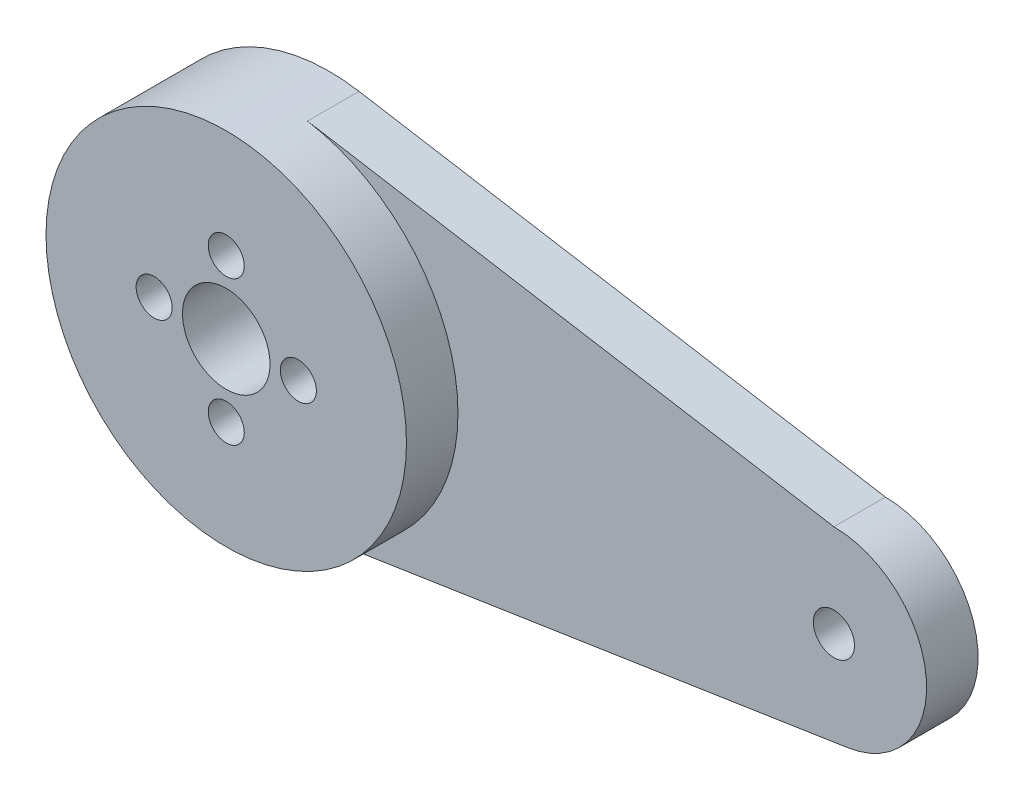
ISO-10303-21;
HEADER;
FILE_DESCRIPTION(('STEP AP214'),'2;1');
FILE_NAME('part.step','',(''),(''),'','','');
FILE_SCHEMA(('AUTOMOTIVE_DESIGN { 1 0 10303 214 1 1 1 1 }'));
ENDSEC;
DATA;
#1=APPLICATION_CONTEXT('core data for automotive mechanical design processes');
#2=APPLICATION_PROTOCOL_DEFINITION('international standard','automotive_design',2000,#1);
#3=PRODUCT_CONTEXT('',#1,'mechanical');
#4=PRODUCT('Part','Part','',(#3));
#5=PRODUCT_RELATED_PRODUCT_CATEGORY('part','',(#4));
#6=PRODUCT_DEFINITION_FORMATION('','',#4);
#7=PRODUCT_DEFINITION_CONTEXT('part definition',#1,'design');
#8=PRODUCT_DEFINITION('design','',#6,#7);
#9=PRODUCT_DEFINITION_SHAPE('','',#8);
#10=(LENGTH_UNIT() NAMED_UNIT(*) SI_UNIT(.MILLI.,.METRE.));
#11=(NAMED_UNIT(*) PLANE_ANGLE_UNIT() SI_UNIT($,.RADIAN.));
#12=(NAMED_UNIT(*) SI_UNIT($,.STERADIAN.) SOLID_ANGLE_UNIT());
#13=UNCERTAINTY_MEASURE_WITH_UNIT(LENGTH_MEASURE(1.E-05),#10,'distance_accuracy_value','');
#14=(GEOMETRIC_REPRESENTATION_CONTEXT(3) GLOBAL_UNCERTAINTY_ASSIGNED_CONTEXT((#13)) GLOBAL_UNIT_ASSIGNED_CONTEXT((#10,
#11,#12)) REPRESENTATION_CONTEXT('',''));
#15=CARTESIAN_POINT('',(0.,0.,0.));
#16=DIRECTION('',(0.,0.,1.));
#17=DIRECTION('',(1.,0.,0.));
#18=AXIS2_PLACEMENT_3D('',#15,#16,#17);
#19=CARTESIAN_POINT('',(-20.2199999704329,57.5799999999971,-5.));
#20=DIRECTION('',(0.,0.,1.));
#21=DIRECTION('',(1.,0.,0.));
#22=AXIS2_PLACEMENT_3D('',#19,#20,#21);
#23=CYLINDRICAL_SURFACE('',#22,17.500000000001);
#24=DIRECTION('',(0.,0.,1.));
#25=VECTOR('',#24,1.);
#26=CARTESIAN_POINT('',(-17.5619966812068,40.2830344130943,-5.));
#27=LINE('',#26,#25);
#28=CARTESIAN_POINT('',(-17.5619966812068,40.2830344130943,-5.));
#29=VERTEX_POINT('',#28);
#30=CARTESIAN_POINT('',(-17.5619966812068,40.2830344130943,0.));
#31=VERTEX_POINT('',#30);
#32=EDGE_CURVE('E36',#29,#31,#27,.T.);
#33=ORIENTED_EDGE('',*,*,#32,.T.);
#34=CARTESIAN_POINT('',(-20.2199999704329,57.5799999999971,0.));
#35=DIRECTION('',(0.,0.,1.));
#36=DIRECTION('',(1.,0.,0.));
#37=AXIS2_PLACEMENT_3D('',#34,#35,#36);
#38=CIRCLE('',#37,17.500000000001);
#39=CARTESIAN_POINT('',(-17.3288748871476,74.8395305774153,0.));
#40=VERTEX_POINT('',#39);
#41=EDGE_CURVE('E11',#31,#40,#38,.T.);
#42=ORIENTED_EDGE('',*,*,#41,.T.);
#43=DIRECTION('',(0.,0.,1.));
#44=VECTOR('',#43,1.);
#45=CARTESIAN_POINT('',(-17.3288748871476,74.8395305774153,-5.));
#46=LINE('',#45,#44);
#47=CARTESIAN_POINT('',(-17.3288748871476,74.8395305774153,-5.));
#48=VERTEX_POINT('',#47);
#49=EDGE_CURVE('E42',#48,#40,#46,.T.);
#50=ORIENTED_EDGE('',*,*,#49,.F.);
#51=CARTESIAN_POINT('',(-20.2199999704329,57.5799999999971,-5.));
#52=DIRECTION('',(0.,0.,1.));
#53=DIRECTION('',(1.,0.,0.));
#54=AXIS2_PLACEMENT_3D('',#51,#52,#53);
#55=CIRCLE('',#54,17.500000000001);
#56=EDGE_CURVE('E87',#48,#29,#55,.T.);
#57=ORIENTED_EDGE('',*,*,#56,.T.);
#58=EDGE_LOOP('',(#33,#42,#50,#57));
#59=FACE_BOUND('',#58,.T.);
#60=CARTESIAN_POINT('',(-20.2199999704329,57.5799999999971,5.));
#61=DIRECTION('',(0.,0.,1.));
#62=DIRECTION('',(1.,0.,0.));
#63=AXIS2_PLACEMENT_3D('',#60,#61,#62);
#64=CIRCLE('',#63,17.500000000001);
#65=CARTESIAN_POINT('',(-2.71999997043187,57.5799999999971,5.));
#66=VERTEX_POINT('',#65);
#67=EDGE_CURVE('E127',#66,#66,#64,.T.);
#68=ORIENTED_EDGE('',*,*,#67,.F.);
#69=EDGE_LOOP('',(#68));
#70=FACE_BOUND('',#69,.T.);
#71=ADVANCED_FACE('F33',(#59,#70),#23,.T.);
#72=CARTESIAN_POINT('',(-17.3288748871476,74.8395305774153,-5.));
#73=DIRECTION('',(0.165207147616288,0.986258890138127,0.));
#74=DIRECTION('',(-0.986258890138127,0.165207147616289,0.));
#75=AXIS2_PLACEMENT_3D('',#72,#73,#74);
#76=PLANE('',#75);
#77=DIRECTION('',(-0.986258890138127,0.165207147616288,0.));
#78=VECTOR('',#77,1.);
#79=CARTESIAN_POINT('',(-17.3288748871476,74.8395305774153,0.));
#80=LINE('',#79,#78);
#81=CARTESIAN_POINT('',(33.7800000295671,66.2783388585902,0.));
#82=VERTEX_POINT('',#81);
#83=EDGE_CURVE('E81',#82,#40,#80,.T.);
#84=ORIENTED_EDGE('',*,*,#83,.F.);
#85=DIRECTION('',(0.,0.,1.));
#86=VECTOR('',#85,1.);
#87=CARTESIAN_POINT('',(33.7800000295671,66.2783388585902,-5.));
#88=LINE('',#87,#86);
#89=CARTESIAN_POINT('',(33.7800000295671,66.2783388585902,-5.));
#90=VERTEX_POINT('',#89);
#91=EDGE_CURVE('E71',#90,#82,#88,.T.);
#92=ORIENTED_EDGE('',*,*,#91,.F.);
#93=DIRECTION('',(-0.986258890138127,0.165207147616288,0.));
#94=VECTOR('',#93,1.);
#95=CARTESIAN_POINT('',(-17.3288748871476,74.8395305774153,-5.));
#96=LINE('',#95,#94);
#97=EDGE_CURVE('E92',#90,#48,#96,.T.);
#98=ORIENTED_EDGE('',*,*,#97,.T.);
#99=ORIENTED_EDGE('',*,*,#49,.T.);
#100=EDGE_LOOP('',(#84,#92,#98,#99));
#101=FACE_BOUND('',#100,.T.);
#102=ADVANCED_FACE('F90',(#101),#76,.T.);
#103=CARTESIAN_POINT('',(33.7800000295671,57.2783388585902,-5.));
#104=DIRECTION('',(0.,0.,1.));
#105=DIRECTION('',(1.,0.,0.));
#106=AXIS2_PLACEMENT_3D('',#103,#104,#105);
#107=CYLINDRICAL_SURFACE('',#106,9.00000000000001);
#108=CARTESIAN_POINT('',(33.7800000295671,57.2783388585902,0.));
#109=DIRECTION('',(0.,0.,1.));
#110=DIRECTION('',(-1.,0.,0.));
#111=AXIS2_PLACEMENT_3D('',#108,#109,#110);
#112=CIRCLE('',#111,9.00000000000001);
#113=CARTESIAN_POINT('',(35.1469731497404,48.382756556755,0.));
#114=VERTEX_POINT('',#113);
#115=EDGE_CURVE('E85',#114,#82,#112,.T.);
#116=ORIENTED_EDGE('',*,*,#115,.F.);
#117=DIRECTION('',(0.,0.,1.));
#118=VECTOR('',#117,1.);
#119=CARTESIAN_POINT('',(35.1469731497404,48.382756556755,-5.));
#120=LINE('',#119,#118);
#121=CARTESIAN_POINT('',(35.1469731497404,48.382756556755,-5.));
#122=VERTEX_POINT('',#121);
#123=EDGE_CURVE('E65',#122,#114,#120,.T.);
#124=ORIENTED_EDGE('',*,*,#123,.F.);
#125=CARTESIAN_POINT('',(33.7800000295671,57.2783388585902,-5.));
#126=DIRECTION('',(0.,0.,1.));
#127=DIRECTION('',(-1.,0.,0.));
#128=AXIS2_PLACEMENT_3D('',#125,#126,#127);
#129=CIRCLE('',#128,9.00000000000001);
#130=EDGE_CURVE('E106',#122,#90,#129,.T.);
#131=ORIENTED_EDGE('',*,*,#130,.T.);
#132=ORIENTED_EDGE('',*,*,#91,.T.);
#133=EDGE_LOOP('',(#116,#124,#131,#132));
#134=FACE_BOUND('',#133,.T.);
#135=ADVANCED_FACE('F168',(#134),#107,.T.);
#136=CARTESIAN_POINT('',(35.1469731497404,48.382756556755,-5.));
#137=DIRECTION('',(0.151885902241479,-0.988398033537245,0.));
#138=DIRECTION('',(0.988398033537245,0.151885902241479,0.));
#139=AXIS2_PLACEMENT_3D('',#136,#137,#138);
#140=PLANE('',#139);
#141=DIRECTION('',(0.988398033537245,0.151885902241479,0.));
#142=VECTOR('',#141,1.);
#143=CARTESIAN_POINT('',(35.1469731497404,48.382756556755,0.));
#144=LINE('',#143,#142);
#145=EDGE_CURVE('E95',#31,#114,#144,.T.);
#146=ORIENTED_EDGE('',*,*,#145,.F.);
#147=ORIENTED_EDGE('',*,*,#32,.F.);
#148=DIRECTION('',(0.988398033537245,0.151885902241479,0.));
#149=VECTOR('',#148,1.);
#150=CARTESIAN_POINT('',(35.1469731497404,48.382756556755,-5.));
#151=LINE('',#150,#149);
#152=EDGE_CURVE('E108',#29,#122,#151,.T.);
#153=ORIENTED_EDGE('',*,*,#152,.T.);
#154=ORIENTED_EDGE('',*,*,#123,.T.);
#155=EDGE_LOOP('',(#146,#147,#153,#154));
#156=FACE_BOUND('',#155,.T.);
#157=ADVANCED_FACE('F96',(#156),#140,.T.);
#158=CARTESIAN_POINT('',(-20.2199999704329,57.5799999999971,-5.));
#159=DIRECTION('',(0.,0.,1.));
#160=DIRECTION('',(1.,0.,0.));
#161=AXIS2_PLACEMENT_3D('',#158,#159,#160);
#162=PLANE('',#161);
#163=CARTESIAN_POINT('',(-13.2199999704329,57.5799999999971,-5.));
#164=DIRECTION('',(0.,0.,1.));
#165=DIRECTION('',(1.,0.,0.));
#166=AXIS2_PLACEMENT_3D('',#163,#164,#165);
#167=CIRCLE('',#166,1.75);
#168=CARTESIAN_POINT('',(-11.4699999704329,57.5799999999971,-5.));
#169=VERTEX_POINT('',#168);
#170=EDGE_CURVE('E114',#169,#169,#167,.T.);
#171=ORIENTED_EDGE('',*,*,#170,.T.);
#172=EDGE_LOOP('',(#171));
#173=FACE_BOUND('',#172,.T.);
#174=CARTESIAN_POINT('',(-27.2199999704329,57.5799999999971,-5.));
#175=DIRECTION('',(0.,0.,1.));
#176=DIRECTION('',(1.,0.,0.));
#177=AXIS2_PLACEMENT_3D('',#174,#175,#176);
#178=CIRCLE('',#177,1.75);
#179=CARTESIAN_POINT('',(-25.4699999704329,57.5799999999971,-5.));
#180=VERTEX_POINT('',#179);
#181=EDGE_CURVE('E119',#180,#180,#178,.T.);
#182=ORIENTED_EDGE('',*,*,#181,.T.);
#183=EDGE_LOOP('',(#182));
#184=FACE_BOUND('',#183,.T.);
#185=CARTESIAN_POINT('',(-20.2199999704329,64.5799999999971,-5.));
#186=DIRECTION('',(0.,0.,1.));
#187=DIRECTION('',(1.,0.,0.));
#188=AXIS2_PLACEMENT_3D('',#185,#186,#187);
#189=CIRCLE('',#188,1.75);
#190=CARTESIAN_POINT('',(-18.4699999704329,64.5799999999971,-5.));
#191=VERTEX_POINT('',#190);
#192=EDGE_CURVE('E122',#191,#191,#189,.T.);
#193=ORIENTED_EDGE('',*,*,#192,.T.);
#194=EDGE_LOOP('',(#193));
#195=FACE_BOUND('',#194,.T.);
#196=CARTESIAN_POINT('',(-20.2199999704329,50.5799999999971,-5.));
#197=DIRECTION('',(0.,0.,1.));
#198=DIRECTION('',(1.,0.,0.));
#199=AXIS2_PLACEMENT_3D('',#196,#197,#198);
#200=CIRCLE('',#199,1.75);
#201=CARTESIAN_POINT('',(-18.4699999704329,50.5799999999971,-5.));
#202=VERTEX_POINT('',#201);
#203=EDGE_CURVE('E125',#202,#202,#200,.T.);
#204=ORIENTED_EDGE('',*,*,#203,.T.);
#205=EDGE_LOOP('',(#204));
#206=FACE_BOUND('',#205,.T.);
#207=CARTESIAN_POINT('',(33.7800000295671,57.2783388585902,-5.));
#208=DIRECTION('',(0.,0.,1.));
#209=DIRECTION('',(1.,0.,0.));
#210=AXIS2_PLACEMENT_3D('',#207,#208,#209);
#211=CIRCLE('',#210,2.);
#212=CARTESIAN_POINT('',(35.7800000295671,57.2783388585902,-5.));
#213=VERTEX_POINT('',#212);
#214=EDGE_CURVE('E101',#213,#213,#211,.T.);
#215=ORIENTED_EDGE('',*,*,#214,.T.);
#216=EDGE_LOOP('',(#215));
#217=FACE_BOUND('',#216,.T.);
#218=CARTESIAN_POINT('',(-20.2199999704329,57.5799999999971,-5.));
#219=DIRECTION('',(0.,0.,1.));
#220=DIRECTION('',(1.,0.,0.));
#221=AXIS2_PLACEMENT_3D('',#218,#219,#220);
#222=CIRCLE('',#221,4.25);
#223=CARTESIAN_POINT('',(-15.9699999704329,57.5799999999971,-5.));
#224=VERTEX_POINT('',#223);
#225=EDGE_CURVE('E97',#224,#224,#222,.T.);
#226=ORIENTED_EDGE('',*,*,#225,.T.);
#227=EDGE_LOOP('',(#226));
#228=FACE_BOUND('',#227,.T.);
#229=ORIENTED_EDGE('',*,*,#56,.F.);
#230=ORIENTED_EDGE('',*,*,#97,.F.);
#231=ORIENTED_EDGE('',*,*,#130,.F.);
#232=ORIENTED_EDGE('',*,*,#152,.F.);
#233=EDGE_LOOP('',(#229,#230,#231,#232));
#234=FACE_BOUND('',#233,.T.);
#235=ADVANCED_FACE('F177',(#173,#184,#195,#206,#217,#228,#234),#162,.F.);
#236=CARTESIAN_POINT('',(-20.2199999704329,57.5799999999971,0.));
#237=DIRECTION('',(0.,0.,1.));
#238=DIRECTION('',(1.,0.,0.));
#239=AXIS2_PLACEMENT_3D('',#236,#237,#238);
#240=PLANE('',#239);
#241=ORIENTED_EDGE('',*,*,#41,.F.);
#242=ORIENTED_EDGE('',*,*,#145,.T.);
#243=ORIENTED_EDGE('',*,*,#115,.T.);
#244=ORIENTED_EDGE('',*,*,#83,.T.);
#245=EDGE_LOOP('',(#241,#242,#243,#244));
#246=FACE_BOUND('',#245,.T.);
#247=CARTESIAN_POINT('',(33.7800000295671,57.2783388585902,0.));
#248=DIRECTION('',(0.,0.,1.));
#249=DIRECTION('',(1.,0.,0.));
#250=AXIS2_PLACEMENT_3D('',#247,#248,#249);
#251=CIRCLE('',#250,2.);
#252=CARTESIAN_POINT('',(35.7800000295671,57.2783388585902,0.));
#253=VERTEX_POINT('',#252);
#254=EDGE_CURVE('E111',#253,#253,#251,.T.);
#255=ORIENTED_EDGE('',*,*,#254,.F.);
#256=EDGE_LOOP('',(#255));
#257=FACE_BOUND('',#256,.T.);
#258=ADVANCED_FACE('F82',(#246,#257),#240,.T.);
#259=CARTESIAN_POINT('',(-20.2199999704329,57.5799999999971,-5.));
#260=DIRECTION('',(0.,0.,1.));
#261=DIRECTION('',(1.,0.,0.));
#262=AXIS2_PLACEMENT_3D('',#259,#260,#261);
#263=CYLINDRICAL_SURFACE('',#262,4.25);
#264=ORIENTED_EDGE('',*,*,#225,.F.);
#265=EDGE_LOOP('',(#264));
#266=FACE_BOUND('',#265,.T.);
#267=CARTESIAN_POINT('',(-20.2199999704329,57.5799999999971,5.));
#268=DIRECTION('',(0.,0.,1.));
#269=DIRECTION('',(1.,0.,0.));
#270=AXIS2_PLACEMENT_3D('',#267,#268,#269);
#271=CIRCLE('',#270,4.25);
#272=CARTESIAN_POINT('',(-15.9699999704329,57.5799999999971,5.));
#273=VERTEX_POINT('',#272);
#274=EDGE_CURVE('E143',#273,#273,#271,.T.);
#275=ORIENTED_EDGE('',*,*,#274,.T.);
#276=EDGE_LOOP('',(#275));
#277=FACE_BOUND('',#276,.T.);
#278=ADVANCED_FACE('F147',(#266,#277),#263,.F.);
#279=CARTESIAN_POINT('',(33.7800000295671,57.2783388585902,-5.));
#280=DIRECTION('',(0.,0.,1.));
#281=DIRECTION('',(1.,0.,0.));
#282=AXIS2_PLACEMENT_3D('',#279,#280,#281);
#283=CYLINDRICAL_SURFACE('',#282,2.);
#284=ORIENTED_EDGE('',*,*,#214,.F.);
#285=EDGE_LOOP('',(#284));
#286=FACE_BOUND('',#285,.T.);
#287=ORIENTED_EDGE('',*,*,#254,.T.);
#288=EDGE_LOOP('',(#287));
#289=FACE_BOUND('',#288,.T.);
#290=ADVANCED_FACE('F189',(#286,#289),#283,.F.);
#291=CARTESIAN_POINT('',(-20.2199999704329,50.5799999999971,-10.));
#292=DIRECTION('',(0.,0.,1.));
#293=DIRECTION('',(1.,0.,0.));
#294=AXIS2_PLACEMENT_3D('',#291,#292,#293);
#295=CYLINDRICAL_SURFACE('',#294,1.75);
#296=ORIENTED_EDGE('',*,*,#203,.F.);
#297=EDGE_LOOP('',(#296));
#298=FACE_BOUND('',#297,.T.);
#299=CARTESIAN_POINT('',(-20.2199999704329,50.5799999999971,5.));
#300=DIRECTION('',(0.,0.,1.));
#301=DIRECTION('',(1.,0.,0.));
#302=AXIS2_PLACEMENT_3D('',#299,#300,#301);
#303=CIRCLE('',#302,1.75);
#304=CARTESIAN_POINT('',(-18.4699999704329,50.5799999999971,5.));
#305=VERTEX_POINT('',#304);
#306=EDGE_CURVE('E134',#305,#305,#303,.T.);
#307=ORIENTED_EDGE('',*,*,#306,.T.);
#308=EDGE_LOOP('',(#307));
#309=FACE_BOUND('',#308,.T.);
#310=ADVANCED_FACE('F192',(#298,#309),#295,.F.);
#311=CARTESIAN_POINT('',(-20.2199999704329,64.5799999999971,-10.));
#312=DIRECTION('',(0.,0.,1.));
#313=DIRECTION('',(1.,0.,0.));
#314=AXIS2_PLACEMENT_3D('',#311,#312,#313);
#315=CYLINDRICAL_SURFACE('',#314,1.75);
#316=ORIENTED_EDGE('',*,*,#192,.F.);
#317=EDGE_LOOP('',(#316));
#318=FACE_BOUND('',#317,.T.);
#319=CARTESIAN_POINT('',(-20.2199999704329,64.5799999999971,5.));
#320=DIRECTION('',(0.,0.,1.));
#321=DIRECTION('',(1.,0.,0.));
#322=AXIS2_PLACEMENT_3D('',#319,#320,#321);
#323=CIRCLE('',#322,1.75);
#324=CARTESIAN_POINT('',(-18.4699999704329,64.5799999999971,5.));
#325=VERTEX_POINT('',#324);
#326=EDGE_CURVE('E140',#325,#325,#323,.T.);
#327=ORIENTED_EDGE('',*,*,#326,.T.);
#328=EDGE_LOOP('',(#327));
#329=FACE_BOUND('',#328,.T.);
#330=ADVANCED_FACE('F196',(#318,#329),#315,.F.);
#331=CARTESIAN_POINT('',(-27.2199999704329,57.5799999999971,-10.));
#332=DIRECTION('',(0.,0.,1.));
#333=DIRECTION('',(1.,0.,0.));
#334=AXIS2_PLACEMENT_3D('',#331,#332,#333);
#335=CYLINDRICAL_SURFACE('',#334,1.75);
#336=ORIENTED_EDGE('',*,*,#181,.F.);
#337=EDGE_LOOP('',(#336));
#338=FACE_BOUND('',#337,.T.);
#339=CARTESIAN_POINT('',(-27.2199999704329,57.5799999999971,5.));
#340=DIRECTION('',(0.,0.,1.));
#341=DIRECTION('',(1.,0.,0.));
#342=AXIS2_PLACEMENT_3D('',#339,#340,#341);
#343=CIRCLE('',#342,1.75);
#344=CARTESIAN_POINT('',(-25.4699999704329,57.5799999999971,5.));
#345=VERTEX_POINT('',#344);
#346=EDGE_CURVE('E131',#345,#345,#343,.T.);
#347=ORIENTED_EDGE('',*,*,#346,.T.);
#348=EDGE_LOOP('',(#347));
#349=FACE_BOUND('',#348,.T.);
#350=ADVANCED_FACE('F157',(#338,#349),#335,.F.);
#351=CARTESIAN_POINT('',(-13.2199999704329,57.5799999999971,-10.));
#352=DIRECTION('',(0.,0.,1.));
#353=DIRECTION('',(1.,0.,0.));
#354=AXIS2_PLACEMENT_3D('',#351,#352,#353);
#355=CYLINDRICAL_SURFACE('',#354,1.75);
#356=ORIENTED_EDGE('',*,*,#170,.F.);
#357=EDGE_LOOP('',(#356));
#358=FACE_BOUND('',#357,.T.);
#359=CARTESIAN_POINT('',(-13.2199999704329,57.5799999999971,5.));
#360=DIRECTION('',(0.,0.,1.));
#361=DIRECTION('',(1.,0.,0.));
#362=AXIS2_PLACEMENT_3D('',#359,#360,#361);
#363=CIRCLE('',#362,1.75);
#364=CARTESIAN_POINT('',(-11.4699999704329,57.5799999999971,5.));
#365=VERTEX_POINT('',#364);
#366=EDGE_CURVE('E137',#365,#365,#363,.T.);
#367=ORIENTED_EDGE('',*,*,#366,.T.);
#368=EDGE_LOOP('',(#367));
#369=FACE_BOUND('',#368,.T.);
#370=ADVANCED_FACE('F151',(#358,#369),#355,.F.);
#371=CARTESIAN_POINT('',(-20.2199999704329,57.5799999999971,5.));
#372=DIRECTION('',(0.,0.,1.));
#373=DIRECTION('',(1.,0.,0.));
#374=AXIS2_PLACEMENT_3D('',#371,#372,#373);
#375=PLANE('',#374);
#376=ORIENTED_EDGE('',*,*,#326,.F.);
#377=EDGE_LOOP('',(#376));
#378=FACE_BOUND('',#377,.T.);
#379=ORIENTED_EDGE('',*,*,#306,.F.);
#380=EDGE_LOOP('',(#379));
#381=FACE_BOUND('',#380,.T.);
#382=ORIENTED_EDGE('',*,*,#67,.T.);
#383=EDGE_LOOP('',(#382));
#384=FACE_BOUND('',#383,.T.);
#385=ORIENTED_EDGE('',*,*,#346,.F.);
#386=EDGE_LOOP('',(#385));
#387=FACE_BOUND('',#386,.T.);
#388=ORIENTED_EDGE('',*,*,#366,.F.);
#389=EDGE_LOOP('',(#388));
#390=FACE_BOUND('',#389,.T.);
#391=ORIENTED_EDGE('',*,*,#274,.F.);
#392=EDGE_LOOP('',(#391));
#393=FACE_BOUND('',#392,.T.);
#394=ADVANCED_FACE('F149',(#378,#381,#384,#387,#390,#393),#375,.T.);
#395=CLOSED_SHELL('',(#71,#102,#135,#157,#235,#258,#278,#290,#310,#330,#350,#370,#394));
#396=MANIFOLD_SOLID_BREP('B2',#395);
#397=ADVANCED_BREP_SHAPE_REPRESENTATION('',(#18,#396),#14);
#398=SHAPE_DEFINITION_REPRESENTATION(#9,#397);
ENDSEC;
END-ISO-10303-21;
